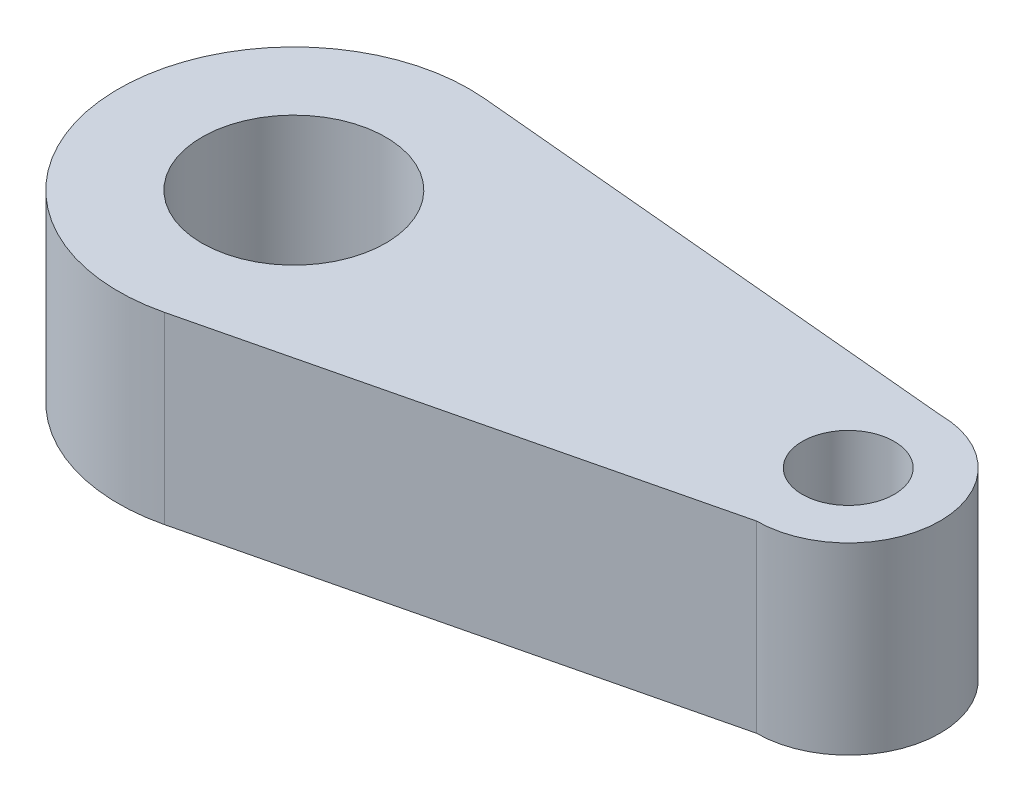
ISO-10303-21;
HEADER;
FILE_DESCRIPTION(('STEP AP214'),'2;1');
FILE_NAME('part.step','',(''),(''),'','','');
FILE_SCHEMA(('AUTOMOTIVE_DESIGN { 1 0 10303 214 1 1 1 1 }'));
ENDSEC;
DATA;
#1=APPLICATION_CONTEXT('core data for automotive mechanical design processes');
#2=APPLICATION_PROTOCOL_DEFINITION('international standard','automotive_design',2000,#1);
#3=PRODUCT_CONTEXT('',#1,'mechanical');
#4=PRODUCT('Part','Part','',(#3));
#5=PRODUCT_RELATED_PRODUCT_CATEGORY('part','',(#4));
#6=PRODUCT_DEFINITION_FORMATION('','',#4);
#7=PRODUCT_DEFINITION_CONTEXT('part definition',#1,'design');
#8=PRODUCT_DEFINITION('design','',#6,#7);
#9=PRODUCT_DEFINITION_SHAPE('','',#8);
#10=(LENGTH_UNIT() NAMED_UNIT(*) SI_UNIT(.MILLI.,.METRE.));
#11=(NAMED_UNIT(*) PLANE_ANGLE_UNIT() SI_UNIT($,.RADIAN.));
#12=(NAMED_UNIT(*) SI_UNIT($,.STERADIAN.) SOLID_ANGLE_UNIT());
#13=UNCERTAINTY_MEASURE_WITH_UNIT(LENGTH_MEASURE(1.E-05),#10,'distance_accuracy_value','');
#14=(GEOMETRIC_REPRESENTATION_CONTEXT(3) GLOBAL_UNCERTAINTY_ASSIGNED_CONTEXT((#13)) GLOBAL_UNIT_ASSIGNED_CONTEXT((#10,
#11,#12)) REPRESENTATION_CONTEXT('',''));
#15=CARTESIAN_POINT('',(0.,0.,0.));
#16=DIRECTION('',(0.,0.,1.));
#17=DIRECTION('',(1.,0.,0.));
#18=AXIS2_PLACEMENT_3D('',#15,#16,#17);
#19=CARTESIAN_POINT('',(0.,4.,0.));
#20=DIRECTION('',(0.,1.,0.));
#21=DIRECTION('',(0.,0.,1.));
#22=AXIS2_PLACEMENT_3D('',#19,#20,#21);
#23=PLANE('',#22);
#24=CARTESIAN_POINT('',(0.,4.,0.));
#25=DIRECTION('',(0.,1.,0.));
#26=DIRECTION('',(0.,0.,1.));
#27=AXIS2_PLACEMENT_3D('',#24,#25,#26);
#28=CIRCLE('',#27,1.);
#29=CARTESIAN_POINT('',(0.,4.,1.));
#30=VERTEX_POINT('',#29);
#31=EDGE_CURVE('E99',#30,#30,#28,.T.);
#32=ORIENTED_EDGE('',*,*,#31,.F.);
#33=EDGE_LOOP('',(#32));
#34=FACE_BOUND('',#33,.T.);
#35=CARTESIAN_POINT('',(0.,4.,0.));
#36=DIRECTION('',(0.,1.,0.));
#37=DIRECTION('',(0.,0.,1.));
#38=AXIS2_PLACEMENT_3D('',#35,#36,#37);
#39=CIRCLE('',#38,2.);
#40=CARTESIAN_POINT('',(0.,4.,2.));
#41=VERTEX_POINT('',#40);
#42=CARTESIAN_POINT('',(0.,4.,-2.));
#43=VERTEX_POINT('',#42);
#44=EDGE_CURVE('E84',#41,#43,#39,.T.);
#45=ORIENTED_EDGE('',*,*,#44,.T.);
#46=DIRECTION('',(-0.995798935509936,0.,-0.0915668064162913));
#47=VECTOR('',#46,1.);
#48=CARTESIAN_POINT('',(0.,4.,-2.));
#49=LINE('',#48,#47);
#50=CARTESIAN_POINT('',(-10.9165330217001,4.,-3.00380913283783));
#51=VERTEX_POINT('',#50);
#52=EDGE_CURVE('E79',#43,#51,#49,.T.);
#53=ORIENTED_EDGE('',*,*,#52,.T.);
#54=CARTESIAN_POINT('',(-11.2660700829758,4.,0.797444259763656));
#55=DIRECTION('',(0.,1.,0.));
#56=DIRECTION('',(0.,0.,1.));
#57=AXIS2_PLACEMENT_3D('',#54,#55,#56);
#58=CIRCLE('',#57,3.81729007438124);
#59=CARTESIAN_POINT('',(-10.3686991077857,4.,4.50775810698143));
#60=VERTEX_POINT('',#59);
#61=EDGE_CURVE('E82',#51,#60,#58,.T.);
#62=ORIENTED_EDGE('',*,*,#61,.T.);
#63=DIRECTION('',(0.971975871605513,0.,-0.235080635137613));
#64=VECTOR('',#63,1.);
#65=CARTESIAN_POINT('',(-10.3686991077857,4.,4.50775810698143));
#66=LINE('',#65,#64);
#67=EDGE_CURVE('E49',#60,#41,#66,.T.);
#68=ORIENTED_EDGE('',*,*,#67,.T.);
#69=EDGE_LOOP('',(#45,#53,#62,#68));
#70=FACE_BOUND('',#69,.T.);
#71=CARTESIAN_POINT('',(-11.2660700829758,4.,0.797444259763656));
#72=DIRECTION('',(0.,1.,0.));
#73=DIRECTION('',(0.,0.,1.));
#74=AXIS2_PLACEMENT_3D('',#71,#72,#73);
#75=CIRCLE('',#74,2.);
#76=CARTESIAN_POINT('',(-11.2660700829758,4.,2.79744425976366));
#77=VERTEX_POINT('',#76);
#78=EDGE_CURVE('E114',#77,#77,#75,.T.);
#79=ORIENTED_EDGE('',*,*,#78,.F.);
#80=EDGE_LOOP('',(#79));
#81=FACE_BOUND('',#80,.T.);
#82=ADVANCED_FACE('F32',(#34,#70,#81),#23,.T.);
#83=CARTESIAN_POINT('',(0.,0.,0.));
#84=DIRECTION('',(0.,1.,0.));
#85=DIRECTION('',(0.,0.,1.));
#86=AXIS2_PLACEMENT_3D('',#83,#84,#85);
#87=PLANE('',#86);
#88=CARTESIAN_POINT('',(0.,0.,0.));
#89=DIRECTION('',(0.,1.,0.));
#90=DIRECTION('',(0.,0.,1.));
#91=AXIS2_PLACEMENT_3D('',#88,#89,#90);
#92=CIRCLE('',#91,2.);
#93=CARTESIAN_POINT('',(0.,0.,2.));
#94=VERTEX_POINT('',#93);
#95=CARTESIAN_POINT('',(0.,0.,-2.));
#96=VERTEX_POINT('',#95);
#97=EDGE_CURVE('E96',#94,#96,#92,.T.);
#98=ORIENTED_EDGE('',*,*,#97,.F.);
#99=DIRECTION('',(0.971975871605513,0.,-0.235080635137613));
#100=VECTOR('',#99,1.);
#101=CARTESIAN_POINT('',(-10.3686991077857,0.,4.50775810698143));
#102=LINE('',#101,#100);
#103=CARTESIAN_POINT('',(-10.3686991077857,0.,4.50775810698143));
#104=VERTEX_POINT('',#103);
#105=EDGE_CURVE('E72',#104,#94,#102,.T.);
#106=ORIENTED_EDGE('',*,*,#105,.F.);
#107=CARTESIAN_POINT('',(-11.2660700829758,0.,0.797444259763656));
#108=DIRECTION('',(0.,1.,0.));
#109=DIRECTION('',(0.,0.,1.));
#110=AXIS2_PLACEMENT_3D('',#107,#108,#109);
#111=CIRCLE('',#110,3.81729007438124);
#112=CARTESIAN_POINT('',(-10.9165330217001,0.,-3.00380913283783));
#113=VERTEX_POINT('',#112);
#114=EDGE_CURVE('E66',#113,#104,#111,.T.);
#115=ORIENTED_EDGE('',*,*,#114,.F.);
#116=DIRECTION('',(-0.995798935509936,0.,-0.0915668064162913));
#117=VECTOR('',#116,1.);
#118=CARTESIAN_POINT('',(0.,0.,-2.));
#119=LINE('',#118,#117);
#120=EDGE_CURVE('E88',#96,#113,#119,.T.);
#121=ORIENTED_EDGE('',*,*,#120,.F.);
#122=EDGE_LOOP('',(#98,#106,#115,#121));
#123=FACE_BOUND('',#122,.T.);
#124=CARTESIAN_POINT('',(0.,0.,0.));
#125=DIRECTION('',(0.,1.,0.));
#126=DIRECTION('',(0.,0.,1.));
#127=AXIS2_PLACEMENT_3D('',#124,#125,#126);
#128=CIRCLE('',#127,1.);
#129=CARTESIAN_POINT('',(0.,0.,1.));
#130=VERTEX_POINT('',#129);
#131=EDGE_CURVE('E111',#130,#130,#128,.T.);
#132=ORIENTED_EDGE('',*,*,#131,.T.);
#133=EDGE_LOOP('',(#132));
#134=FACE_BOUND('',#133,.T.);
#135=CARTESIAN_POINT('',(-11.2660700829758,0.,0.797444259763656));
#136=DIRECTION('',(0.,1.,0.));
#137=DIRECTION('',(0.,0.,1.));
#138=AXIS2_PLACEMENT_3D('',#135,#136,#137);
#139=CIRCLE('',#138,2.);
#140=CARTESIAN_POINT('',(-11.2660700829758,0.,2.79744425976366));
#141=VERTEX_POINT('',#140);
#142=EDGE_CURVE('E117',#141,#141,#139,.T.);
#143=ORIENTED_EDGE('',*,*,#142,.T.);
#144=EDGE_LOOP('',(#143));
#145=FACE_BOUND('',#144,.T.);
#146=ADVANCED_FACE('F107',(#123,#134,#145),#87,.F.);
#147=CARTESIAN_POINT('',(0.,4.,0.));
#148=DIRECTION('',(0.,-1.,0.));
#149=DIRECTION('',(0.,0.,-1.));
#150=AXIS2_PLACEMENT_3D('',#147,#148,#149);
#151=CYLINDRICAL_SURFACE('',#150,2.);
#152=ORIENTED_EDGE('',*,*,#97,.T.);
#153=DIRECTION('',(0.,-1.,0.));
#154=VECTOR('',#153,1.);
#155=CARTESIAN_POINT('',(0.,4.,-2.));
#156=LINE('',#155,#154);
#157=EDGE_CURVE('E11',#43,#96,#156,.T.);
#158=ORIENTED_EDGE('',*,*,#157,.F.);
#159=ORIENTED_EDGE('',*,*,#44,.F.);
#160=DIRECTION('',(0.,-1.,0.));
#161=VECTOR('',#160,1.);
#162=CARTESIAN_POINT('',(0.,4.,2.));
#163=LINE('',#162,#161);
#164=EDGE_CURVE('E92',#41,#94,#163,.T.);
#165=ORIENTED_EDGE('',*,*,#164,.T.);
#166=EDGE_LOOP('',(#152,#158,#159,#165));
#167=FACE_BOUND('',#166,.T.);
#168=ADVANCED_FACE('F34',(#167),#151,.T.);
#169=CARTESIAN_POINT('',(0.,4.,-2.));
#170=DIRECTION('',(-0.0915668064162913,0.,0.995798935509936));
#171=DIRECTION('',(0.995798935509936,0.,0.0915668064162913));
#172=AXIS2_PLACEMENT_3D('',#169,#170,#171);
#173=PLANE('',#172);
#174=ORIENTED_EDGE('',*,*,#120,.T.);
#175=DIRECTION('',(0.,-1.,0.));
#176=VECTOR('',#175,1.);
#177=CARTESIAN_POINT('',(-10.9165330217001,4.,-3.00380913283783));
#178=LINE('',#177,#176);
#179=EDGE_CURVE('E41',#51,#113,#178,.T.);
#180=ORIENTED_EDGE('',*,*,#179,.F.);
#181=ORIENTED_EDGE('',*,*,#52,.F.);
#182=ORIENTED_EDGE('',*,*,#157,.T.);
#183=EDGE_LOOP('',(#174,#180,#181,#182));
#184=FACE_BOUND('',#183,.T.);
#185=ADVANCED_FACE('F87',(#184),#173,.F.);
#186=CARTESIAN_POINT('',(-11.2660700829758,4.,0.797444259763656));
#187=DIRECTION('',(0.,-1.,0.));
#188=DIRECTION('',(0.,0.,-1.));
#189=AXIS2_PLACEMENT_3D('',#186,#187,#188);
#190=CYLINDRICAL_SURFACE('',#189,3.81729007438124);
#191=ORIENTED_EDGE('',*,*,#114,.T.);
#192=DIRECTION('',(0.,-1.,0.));
#193=VECTOR('',#192,1.);
#194=CARTESIAN_POINT('',(-10.3686991077857,4.,4.50775810698143));
#195=LINE('',#194,#193);
#196=EDGE_CURVE('E89',#60,#104,#195,.T.);
#197=ORIENTED_EDGE('',*,*,#196,.F.);
#198=ORIENTED_EDGE('',*,*,#61,.F.);
#199=ORIENTED_EDGE('',*,*,#179,.T.);
#200=EDGE_LOOP('',(#191,#197,#198,#199));
#201=FACE_BOUND('',#200,.T.);
#202=ADVANCED_FACE('F90',(#201),#190,.T.);
#203=CARTESIAN_POINT('',(-10.3686991077857,4.,4.50775810698143));
#204=DIRECTION('',(-0.235080635137613,0.,-0.971975871605513));
#205=DIRECTION('',(-0.971975871605513,0.,0.235080635137613));
#206=AXIS2_PLACEMENT_3D('',#203,#204,#205);
#207=PLANE('',#206);
#208=ORIENTED_EDGE('',*,*,#105,.T.);
#209=ORIENTED_EDGE('',*,*,#164,.F.);
#210=ORIENTED_EDGE('',*,*,#67,.F.);
#211=ORIENTED_EDGE('',*,*,#196,.T.);
#212=EDGE_LOOP('',(#208,#209,#210,#211));
#213=FACE_BOUND('',#212,.T.);
#214=ADVANCED_FACE('F104',(#213),#207,.F.);
#215=CARTESIAN_POINT('',(0.,4.,0.));
#216=DIRECTION('',(0.,-1.,0.));
#217=DIRECTION('',(0.,0.,-1.));
#218=AXIS2_PLACEMENT_3D('',#215,#216,#217);
#219=CYLINDRICAL_SURFACE('',#218,1.);
#220=ORIENTED_EDGE('',*,*,#31,.T.);
#221=EDGE_LOOP('',(#220));
#222=FACE_BOUND('',#221,.T.);
#223=ORIENTED_EDGE('',*,*,#131,.F.);
#224=EDGE_LOOP('',(#223));
#225=FACE_BOUND('',#224,.T.);
#226=ADVANCED_FACE('F134',(#222,#225),#219,.F.);
#227=CARTESIAN_POINT('',(-11.2660700829758,4.,0.797444259763656));
#228=DIRECTION('',(0.,-1.,0.));
#229=DIRECTION('',(0.,0.,-1.));
#230=AXIS2_PLACEMENT_3D('',#227,#228,#229);
#231=CYLINDRICAL_SURFACE('',#230,2.);
#232=ORIENTED_EDGE('',*,*,#78,.T.);
#233=EDGE_LOOP('',(#232));
#234=FACE_BOUND('',#233,.T.);
#235=ORIENTED_EDGE('',*,*,#142,.F.);
#236=EDGE_LOOP('',(#235));
#237=FACE_BOUND('',#236,.T.);
#238=ADVANCED_FACE('F123',(#234,#237),#231,.F.);
#239=CLOSED_SHELL('',(#82,#146,#168,#185,#202,#214,#226,#238));
#240=MANIFOLD_SOLID_BREP('B2',#239);
#241=ADVANCED_BREP_SHAPE_REPRESENTATION('',(#18,#240),#14);
#242=SHAPE_DEFINITION_REPRESENTATION(#9,#241);
ENDSEC;
END-ISO-10303-21;
